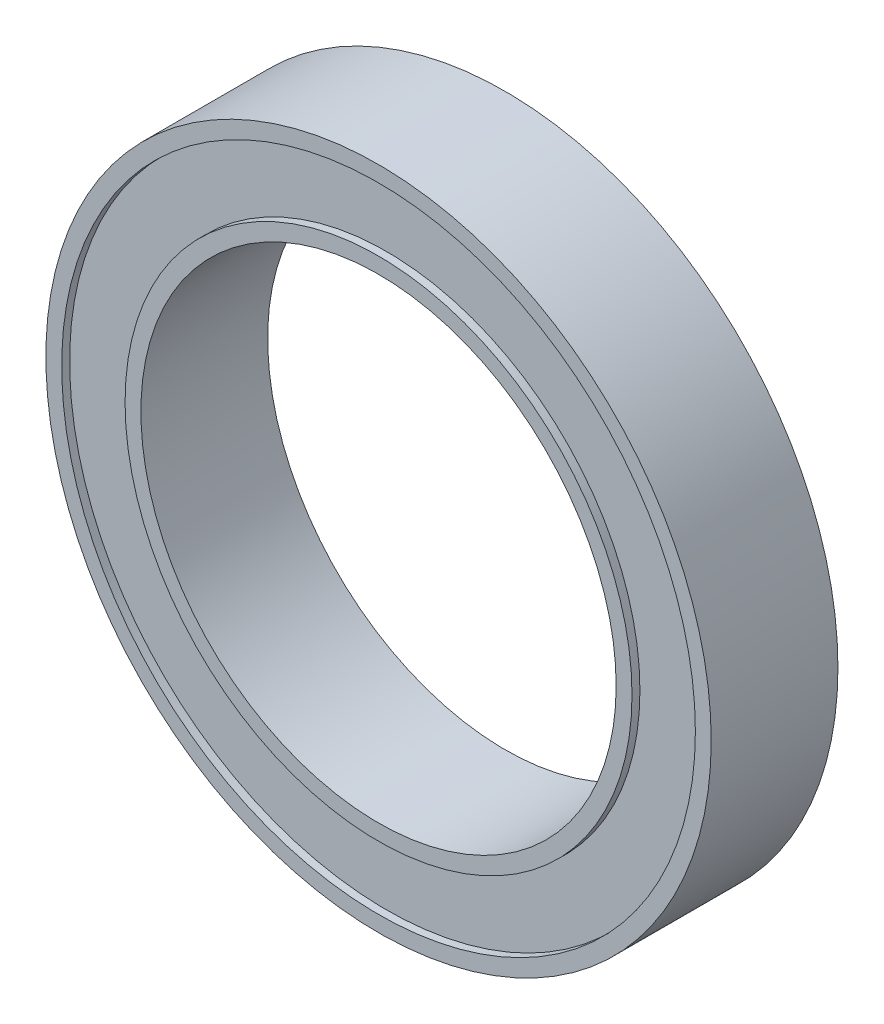
ISO-10303-21;
HEADER;
FILE_DESCRIPTION(('STEP AP214'),'2;1');
FILE_NAME('part.step','',(''),(''),'','','');
FILE_SCHEMA(('AUTOMOTIVE_DESIGN { 1 0 10303 214 1 1 1 1 }'));
ENDSEC;
DATA;
#1=APPLICATION_CONTEXT('core data for automotive mechanical design processes');
#2=APPLICATION_PROTOCOL_DEFINITION('international standard','automotive_design',2000,#1);
#3=PRODUCT_CONTEXT('',#1,'mechanical');
#4=PRODUCT('Part','Part','',(#3));
#5=PRODUCT_RELATED_PRODUCT_CATEGORY('part','',(#4));
#6=PRODUCT_DEFINITION_FORMATION('','',#4);
#7=PRODUCT_DEFINITION_CONTEXT('part definition',#1,'design');
#8=PRODUCT_DEFINITION('design','',#6,#7);
#9=PRODUCT_DEFINITION_SHAPE('','',#8);
#10=(LENGTH_UNIT() NAMED_UNIT(*) SI_UNIT(.MILLI.,.METRE.));
#11=(NAMED_UNIT(*) PLANE_ANGLE_UNIT() SI_UNIT($,.RADIAN.));
#12=(NAMED_UNIT(*) SI_UNIT($,.STERADIAN.) SOLID_ANGLE_UNIT());
#13=UNCERTAINTY_MEASURE_WITH_UNIT(LENGTH_MEASURE(1.E-05),#10,'distance_accuracy_value','');
#14=(GEOMETRIC_REPRESENTATION_CONTEXT(3) GLOBAL_UNCERTAINTY_ASSIGNED_CONTEXT((#13)) GLOBAL_UNIT_ASSIGNED_CONTEXT((#10,
#11,#12)) REPRESENTATION_CONTEXT('',''));
#15=CARTESIAN_POINT('',(0.,0.,0.));
#16=DIRECTION('',(0.,0.,1.));
#17=DIRECTION('',(1.,0.,0.));
#18=AXIS2_PLACEMENT_3D('',#15,#16,#17);
#19=CARTESIAN_POINT('',(0.,0.,4.));
#20=DIRECTION('',(0.,0.,-1.));
#21=DIRECTION('',(-1.,0.,0.));
#22=AXIS2_PLACEMENT_3D('',#19,#20,#21);
#23=CYLINDRICAL_SURFACE('',#22,10.);
#24=CARTESIAN_POINT('',(0.,0.,0.));
#25=DIRECTION('',(0.,0.,1.));
#26=DIRECTION('',(1.,0.,0.));
#27=AXIS2_PLACEMENT_3D('',#24,#25,#26);
#28=CIRCLE('',#27,10.);
#29=CARTESIAN_POINT('',(10.,0.,0.));
#30=VERTEX_POINT('',#29);
#31=EDGE_CURVE('E84',#30,#30,#28,.T.);
#32=ORIENTED_EDGE('',*,*,#31,.F.);
#33=EDGE_LOOP('',(#32));
#34=FACE_BOUND('',#33,.T.);
#35=CARTESIAN_POINT('',(0.,0.,0.25));
#36=DIRECTION('',(0.,0.,1.));
#37=DIRECTION('',(1.,0.,0.));
#38=AXIS2_PLACEMENT_3D('',#35,#36,#37);
#39=CIRCLE('',#38,10.);
#40=CARTESIAN_POINT('',(10.,0.,0.25));
#41=VERTEX_POINT('',#40);
#42=EDGE_CURVE('E78',#41,#41,#39,.T.);
#43=ORIENTED_EDGE('',*,*,#42,.T.);
#44=EDGE_LOOP('',(#43));
#45=FACE_BOUND('',#44,.T.);
#46=ADVANCED_FACE('F55',(#34,#45),#23,.F.);
#47=CARTESIAN_POINT('',(0.,0.,3.75));
#48=DIRECTION('',(0.,0.,1.));
#49=DIRECTION('',(1.,0.,0.));
#50=AXIS2_PLACEMENT_3D('',#47,#48,#49);
#51=CIRCLE('',#50,10.);
#52=CARTESIAN_POINT('',(10.,0.,3.75));
#53=VERTEX_POINT('',#52);
#54=EDGE_CURVE('E63',#53,#53,#51,.T.);
#55=ORIENTED_EDGE('',*,*,#54,.F.);
#56=EDGE_LOOP('',(#55));
#57=FACE_BOUND('',#56,.T.);
#58=CARTESIAN_POINT('',(0.,0.,4.));
#59=DIRECTION('',(0.,0.,1.));
#60=DIRECTION('',(1.,0.,0.));
#61=AXIS2_PLACEMENT_3D('',#58,#59,#60);
#62=CIRCLE('',#61,10.);
#63=CARTESIAN_POINT('',(10.,0.,4.));
#64=VERTEX_POINT('',#63);
#65=EDGE_CURVE('E74',#64,#64,#62,.T.);
#66=ORIENTED_EDGE('',*,*,#65,.T.);
#67=EDGE_LOOP('',(#66));
#68=FACE_BOUND('',#67,.T.);
#69=ADVANCED_FACE('F57',(#57,#68),#23,.F.);
#70=CARTESIAN_POINT('',(0.,0.,4.));
#71=DIRECTION('',(0.,0.,-1.));
#72=DIRECTION('',(-1.,0.,0.));
#73=AXIS2_PLACEMENT_3D('',#70,#71,#72);
#74=CYLINDRICAL_SURFACE('',#73,10.5);
#75=CARTESIAN_POINT('',(0.,0.,4.));
#76=DIRECTION('',(0.,0.,1.));
#77=DIRECTION('',(1.,0.,0.));
#78=AXIS2_PLACEMENT_3D('',#75,#76,#77);
#79=CIRCLE('',#78,10.5);
#80=CARTESIAN_POINT('',(10.5,0.,4.));
#81=VERTEX_POINT('',#80);
#82=EDGE_CURVE('E68',#81,#81,#79,.T.);
#83=ORIENTED_EDGE('',*,*,#82,.F.);
#84=EDGE_LOOP('',(#83));
#85=FACE_BOUND('',#84,.T.);
#86=CARTESIAN_POINT('',(0.,0.,0.));
#87=DIRECTION('',(0.,0.,1.));
#88=DIRECTION('',(1.,0.,0.));
#89=AXIS2_PLACEMENT_3D('',#86,#87,#88);
#90=CIRCLE('',#89,10.5);
#91=CARTESIAN_POINT('',(10.5,0.,0.));
#92=VERTEX_POINT('',#91);
#93=EDGE_CURVE('E82',#92,#92,#90,.T.);
#94=ORIENTED_EDGE('',*,*,#93,.T.);
#95=EDGE_LOOP('',(#94));
#96=FACE_BOUND('',#95,.T.);
#97=ADVANCED_FACE('F91',(#85,#96),#74,.T.);
#98=CARTESIAN_POINT('',(0.,0.,4.));
#99=DIRECTION('',(0.,0.,1.));
#100=DIRECTION('',(1.,0.,0.));
#101=AXIS2_PLACEMENT_3D('',#98,#99,#100);
#102=PLANE('',#101);
#103=ORIENTED_EDGE('',*,*,#65,.F.);
#104=EDGE_LOOP('',(#103));
#105=FACE_BOUND('',#104,.T.);
#106=ORIENTED_EDGE('',*,*,#82,.T.);
#107=EDGE_LOOP('',(#106));
#108=FACE_BOUND('',#107,.T.);
#109=ADVANCED_FACE('F96',(#105,#108),#102,.T.);
#110=CARTESIAN_POINT('',(0.,0.,0.));
#111=DIRECTION('',(0.,0.,1.));
#112=DIRECTION('',(1.,0.,0.));
#113=AXIS2_PLACEMENT_3D('',#110,#111,#112);
#114=PLANE('',#113);
#115=ORIENTED_EDGE('',*,*,#31,.T.);
#116=EDGE_LOOP('',(#115));
#117=FACE_BOUND('',#116,.T.);
#118=ORIENTED_EDGE('',*,*,#93,.F.);
#119=EDGE_LOOP('',(#118));
#120=FACE_BOUND('',#119,.T.);
#121=ADVANCED_FACE('F93',(#117,#120),#114,.F.);
#122=CARTESIAN_POINT('',(0.,0.,3.75));
#123=DIRECTION('',(0.,0.,1.));
#124=DIRECTION('',(1.,0.,0.));
#125=AXIS2_PLACEMENT_3D('',#122,#123,#124);
#126=PLANE('',#125);
#127=CARTESIAN_POINT('',(0.,0.,3.75));
#128=DIRECTION('',(0.,0.,1.));
#129=DIRECTION('',(1.,0.,0.));
#130=AXIS2_PLACEMENT_3D('',#127,#128,#129);
#131=CIRCLE('',#130,8.);
#132=CARTESIAN_POINT('',(8.,0.,3.75));
#133=VERTEX_POINT('',#132);
#134=EDGE_CURVE('E120',#133,#133,#131,.F.);
#135=ORIENTED_EDGE('',*,*,#134,.T.);
#136=EDGE_LOOP('',(#135));
#137=FACE_BOUND('',#136,.T.);
#138=ORIENTED_EDGE('',*,*,#54,.T.);
#139=EDGE_LOOP('',(#138));
#140=FACE_BOUND('',#139,.T.);
#141=ADVANCED_FACE('F95',(#137,#140),#126,.T.);
#142=CARTESIAN_POINT('',(0.,0.,0.25));
#143=DIRECTION('',(0.,0.,1.));
#144=DIRECTION('',(1.,0.,0.));
#145=AXIS2_PLACEMENT_3D('',#142,#143,#144);
#146=PLANE('',#145);
#147=CARTESIAN_POINT('',(0.,0.,0.25));
#148=DIRECTION('',(0.,0.,1.));
#149=DIRECTION('',(1.,0.,0.));
#150=AXIS2_PLACEMENT_3D('',#147,#148,#149);
#151=CIRCLE('',#150,8.);
#152=CARTESIAN_POINT('',(8.,0.,0.25));
#153=VERTEX_POINT('',#152);
#154=EDGE_CURVE('E11',#153,#153,#151,.F.);
#155=ORIENTED_EDGE('',*,*,#154,.F.);
#156=EDGE_LOOP('',(#155));
#157=FACE_BOUND('',#156,.T.);
#158=ORIENTED_EDGE('',*,*,#42,.F.);
#159=EDGE_LOOP('',(#158));
#160=FACE_BOUND('',#159,.T.);
#161=ADVANCED_FACE('F104',(#157,#160),#146,.F.);
#162=CARTESIAN_POINT('',(0.,0.,0.));
#163=DIRECTION('',(0.,0.,1.));
#164=DIRECTION('',(1.,0.,0.));
#165=AXIS2_PLACEMENT_3D('',#162,#163,#164);
#166=PLANE('',#165);
#167=CARTESIAN_POINT('',(0.,0.,0.));
#168=DIRECTION('',(0.,0.,1.));
#169=DIRECTION('',(1.,0.,0.));
#170=AXIS2_PLACEMENT_3D('',#167,#168,#169);
#171=CIRCLE('',#170,7.5);
#172=CARTESIAN_POINT('',(7.5,0.,0.));
#173=VERTEX_POINT('',#172);
#174=EDGE_CURVE('E134',#173,#173,#171,.T.);
#175=ORIENTED_EDGE('',*,*,#174,.T.);
#176=EDGE_LOOP('',(#175));
#177=FACE_BOUND('',#176,.T.);
#178=CARTESIAN_POINT('',(0.,0.,0.));
#179=DIRECTION('',(0.,0.,1.));
#180=DIRECTION('',(1.,0.,0.));
#181=AXIS2_PLACEMENT_3D('',#178,#179,#180);
#182=CIRCLE('',#181,8.);
#183=CARTESIAN_POINT('',(8.,0.,0.));
#184=VERTEX_POINT('',#183);
#185=EDGE_CURVE('E130',#184,#184,#182,.T.);
#186=ORIENTED_EDGE('',*,*,#185,.F.);
#187=EDGE_LOOP('',(#186));
#188=FACE_BOUND('',#187,.T.);
#189=ADVANCED_FACE('F162',(#177,#188),#166,.F.);
#190=CARTESIAN_POINT('',(0.,0.,4.));
#191=DIRECTION('',(0.,0.,-1.));
#192=DIRECTION('',(-1.,0.,0.));
#193=AXIS2_PLACEMENT_3D('',#190,#191,#192);
#194=CYLINDRICAL_SURFACE('',#193,8.);
#195=ORIENTED_EDGE('',*,*,#185,.T.);
#196=EDGE_LOOP('',(#195));
#197=FACE_BOUND('',#196,.T.);
#198=ORIENTED_EDGE('',*,*,#154,.T.);
#199=EDGE_LOOP('',(#198));
#200=FACE_BOUND('',#199,.T.);
#201=ADVANCED_FACE('F154',(#197,#200),#194,.T.);
#202=CARTESIAN_POINT('',(0.,0.,3.75));
#203=DIRECTION('',(0.,0.,-1.));
#204=DIRECTION('',(-1.,0.,0.));
#205=AXIS2_PLACEMENT_3D('',#202,#203,#204);
#206=CYLINDRICAL_SURFACE('',#205,7.5);
#207=ORIENTED_EDGE('',*,*,#174,.F.);
#208=EDGE_LOOP('',(#207));
#209=FACE_BOUND('',#208,.T.);
#210=CARTESIAN_POINT('',(0.,0.,4.));
#211=DIRECTION('',(0.,0.,1.));
#212=DIRECTION('',(1.,0.,0.));
#213=AXIS2_PLACEMENT_3D('',#210,#211,#212);
#214=CIRCLE('',#213,7.5);
#215=CARTESIAN_POINT('',(7.5,0.,4.));
#216=VERTEX_POINT('',#215);
#217=EDGE_CURVE('E127',#216,#216,#214,.T.);
#218=ORIENTED_EDGE('',*,*,#217,.T.);
#219=EDGE_LOOP('',(#218));
#220=FACE_BOUND('',#219,.T.);
#221=ADVANCED_FACE('F142',(#209,#220),#206,.F.);
#222=ORIENTED_EDGE('',*,*,#134,.F.);
#223=EDGE_LOOP('',(#222));
#224=FACE_BOUND('',#223,.T.);
#225=CARTESIAN_POINT('',(0.,0.,4.));
#226=DIRECTION('',(0.,0.,1.));
#227=DIRECTION('',(1.,0.,0.));
#228=AXIS2_PLACEMENT_3D('',#225,#226,#227);
#229=CIRCLE('',#228,8.);
#230=CARTESIAN_POINT('',(8.,0.,4.));
#231=VERTEX_POINT('',#230);
#232=EDGE_CURVE('E123',#231,#231,#229,.T.);
#233=ORIENTED_EDGE('',*,*,#232,.F.);
#234=EDGE_LOOP('',(#233));
#235=FACE_BOUND('',#234,.T.);
#236=ADVANCED_FACE('F147',(#224,#235),#194,.T.);
#237=CARTESIAN_POINT('',(0.,0.,4.));
#238=DIRECTION('',(0.,0.,1.));
#239=DIRECTION('',(1.,0.,0.));
#240=AXIS2_PLACEMENT_3D('',#237,#238,#239);
#241=PLANE('',#240);
#242=ORIENTED_EDGE('',*,*,#217,.F.);
#243=EDGE_LOOP('',(#242));
#244=FACE_BOUND('',#243,.T.);
#245=ORIENTED_EDGE('',*,*,#232,.T.);
#246=EDGE_LOOP('',(#245));
#247=FACE_BOUND('',#246,.T.);
#248=ADVANCED_FACE('F144',(#244,#247),#241,.T.);
#249=CLOSED_SHELL('',(#46,#69,#97,#109,#121,#141,#161,#189,#201,#221,#236,#248));
#250=MANIFOLD_SOLID_BREP('B2',#249);
#251=ADVANCED_BREP_SHAPE_REPRESENTATION('',(#18,#250),#14);
#252=SHAPE_DEFINITION_REPRESENTATION(#9,#251);
ENDSEC;
END-ISO-10303-21;
